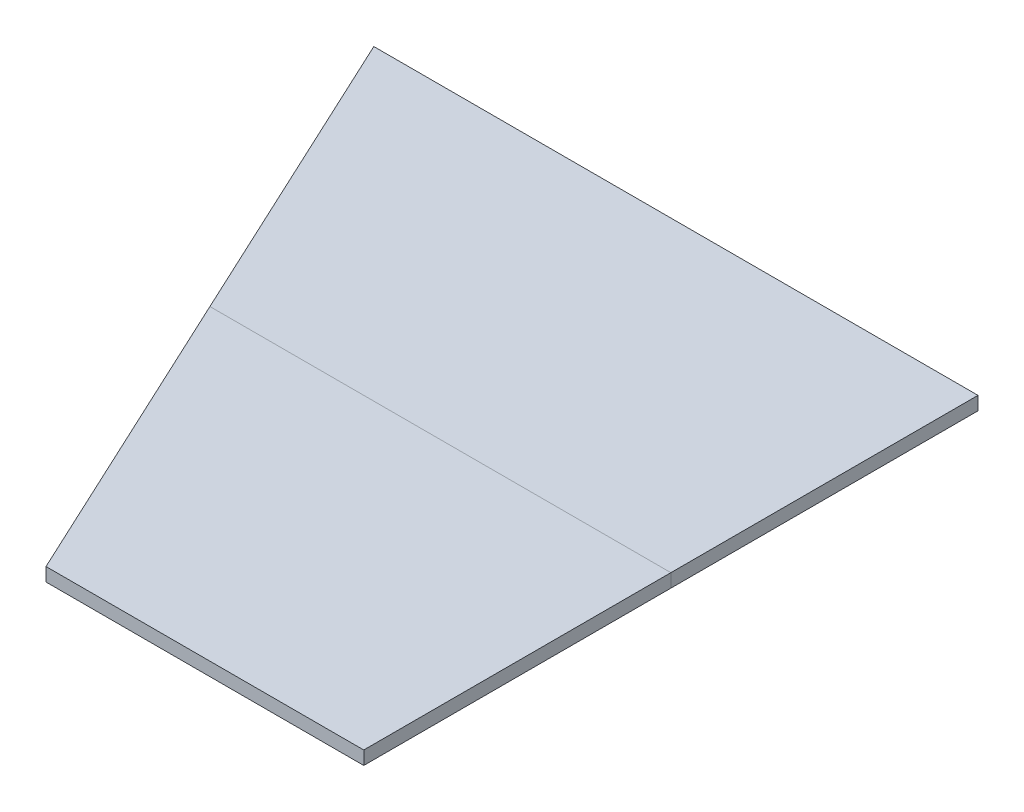
ISO-10303-21;
HEADER;
FILE_DESCRIPTION(('STEP AP214'),'2;1');
FILE_NAME('part.step','',(''),(''),'','','');
FILE_SCHEMA(('AUTOMOTIVE_DESIGN { 1 0 10303 214 1 1 1 1 }'));
ENDSEC;
DATA;
#1=APPLICATION_CONTEXT('core data for automotive mechanical design processes');
#2=APPLICATION_PROTOCOL_DEFINITION('international standard','automotive_design',2000,#1);
#3=PRODUCT_CONTEXT('',#1,'mechanical');
#4=PRODUCT('Part','Part','',(#3));
#5=PRODUCT_RELATED_PRODUCT_CATEGORY('part','',(#4));
#6=PRODUCT_DEFINITION_FORMATION('','',#4);
#7=PRODUCT_DEFINITION_CONTEXT('part definition',#1,'design');
#8=PRODUCT_DEFINITION('design','',#6,#7);
#9=PRODUCT_DEFINITION_SHAPE('','',#8);
#10=(LENGTH_UNIT() NAMED_UNIT(*) SI_UNIT(.MILLI.,.METRE.));
#11=(NAMED_UNIT(*) PLANE_ANGLE_UNIT() SI_UNIT($,.RADIAN.));
#12=(NAMED_UNIT(*) SI_UNIT($,.STERADIAN.) SOLID_ANGLE_UNIT());
#13=UNCERTAINTY_MEASURE_WITH_UNIT(LENGTH_MEASURE(1.E-05),#10,'distance_accuracy_value','');
#14=(GEOMETRIC_REPRESENTATION_CONTEXT(3) GLOBAL_UNCERTAINTY_ASSIGNED_CONTEXT((#13)) GLOBAL_UNIT_ASSIGNED_CONTEXT((#10,
#11,#12)) REPRESENTATION_CONTEXT('',''));
#15=CARTESIAN_POINT('',(0.,0.,0.));
#16=DIRECTION('',(0.,0.,1.));
#17=DIRECTION('',(1.,0.,0.));
#18=AXIS2_PLACEMENT_3D('',#15,#16,#17);
#19=CARTESIAN_POINT('',(0.,0.,91.5));
#20=DIRECTION('',(0.,0.,-1.));
#21=DIRECTION('',(-1.,0.,0.));
#22=AXIS2_PLACEMENT_3D('',#19,#20,#21);
#23=PLANE('',#22);
#24=DIRECTION('',(-1.,0.,0.));
#25=VECTOR('',#24,1.);
#26=CARTESIAN_POINT('',(0.,4.,91.5));
#27=LINE('',#26,#25);
#28=CARTESIAN_POINT('',(90.,4.,91.5));
#29=VERTEX_POINT('',#28);
#30=CARTESIAN_POINT('',(-47.3328492788179,4.,91.5));
#31=VERTEX_POINT('',#30);
#32=EDGE_CURVE('E88',#29,#31,#27,.T.);
#33=ORIENTED_EDGE('',*,*,#32,.F.);
#34=DIRECTION('',(0.,1.,0.));
#35=VECTOR('',#34,1.);
#36=CARTESIAN_POINT('',(90.,4.,91.5));
#37=LINE('',#36,#35);
#38=CARTESIAN_POINT('',(90.,0.,91.5));
#39=VERTEX_POINT('',#38);
#40=EDGE_CURVE('E96',#39,#29,#37,.T.);
#41=ORIENTED_EDGE('',*,*,#40,.F.);
#42=DIRECTION('',(-1.,0.,0.));
#43=VECTOR('',#42,1.);
#44=CARTESIAN_POINT('',(0.,0.,91.5));
#45=LINE('',#44,#43);
#46=CARTESIAN_POINT('',(-47.3328492788179,0.,91.5));
#47=VERTEX_POINT('',#46);
#48=EDGE_CURVE('E104',#39,#47,#45,.T.);
#49=ORIENTED_EDGE('',*,*,#48,.T.);
#50=DIRECTION('',(0.,1.,0.));
#51=VECTOR('',#50,1.);
#52=CARTESIAN_POINT('',(-47.3328492788179,4.,91.5));
#53=LINE('',#52,#51);
#54=EDGE_CURVE('E105',#47,#31,#53,.T.);
#55=ORIENTED_EDGE('',*,*,#54,.T.);
#56=EDGE_LOOP('',(#33,#41,#49,#55));
#57=FACE_BOUND('',#56,.T.);
#58=ADVANCED_FACE('F52',(#57),#23,.T.);
#59=CARTESIAN_POINT('',(90.,4.,0.));
#60=DIRECTION('',(1.,0.,0.));
#61=DIRECTION('',(0.,0.,-1.));
#62=AXIS2_PLACEMENT_3D('',#59,#60,#61);
#63=PLANE('',#62);
#64=DIRECTION('',(0.,0.,1.));
#65=VECTOR('',#64,1.);
#66=CARTESIAN_POINT('',(90.,0.,0.));
#67=LINE('',#66,#65);
#68=CARTESIAN_POINT('',(90.,0.,183.));
#69=VERTEX_POINT('',#68);
#70=EDGE_CURVE('E13',#39,#69,#67,.T.);
#71=ORIENTED_EDGE('',*,*,#70,.F.);
#72=ORIENTED_EDGE('',*,*,#40,.T.);
#73=DIRECTION('',(0.,0.,1.));
#74=VECTOR('',#73,1.);
#75=CARTESIAN_POINT('',(90.,4.,0.));
#76=LINE('',#75,#74);
#77=CARTESIAN_POINT('',(90.,4.,183.));
#78=VERTEX_POINT('',#77);
#79=EDGE_CURVE('E79',#29,#78,#76,.T.);
#80=ORIENTED_EDGE('',*,*,#79,.T.);
#81=DIRECTION('',(0.,-1.,0.));
#82=VECTOR('',#81,1.);
#83=CARTESIAN_POINT('',(90.,4.,183.));
#84=LINE('',#83,#82);
#85=EDGE_CURVE('E98',#78,#69,#84,.T.);
#86=ORIENTED_EDGE('',*,*,#85,.T.);
#87=EDGE_LOOP('',(#71,#72,#80,#86));
#88=FACE_BOUND('',#87,.T.);
#89=ADVANCED_FACE('F95',(#88),#63,.T.);
#90=CARTESIAN_POINT('',(-73.9254424358944,4.,34.4719999403539));
#91=DIRECTION('',(0.906307787036651,0.,-0.422618261740697));
#92=DIRECTION('',(-0.422618261740697,0.,-0.906307787036651));
#93=AXIS2_PLACEMENT_3D('',#90,#91,#92);
#94=PLANE('',#93);
#95=ORIENTED_EDGE('',*,*,#54,.F.);
#96=DIRECTION('',(0.422618261740697,0.,0.906307787036651));
#97=VECTOR('',#96,1.);
#98=CARTESIAN_POINT('',(-73.9254424358944,0.,34.4719999403539));
#99=LINE('',#98,#97);
#100=CARTESIAN_POINT('',(-4.66569855763578,0.,183.));
#101=VERTEX_POINT('',#100);
#102=EDGE_CURVE('E61',#47,#101,#99,.T.);
#103=ORIENTED_EDGE('',*,*,#102,.T.);
#104=DIRECTION('',(0.,-1.,0.));
#105=VECTOR('',#104,1.);
#106=CARTESIAN_POINT('',(-4.66569855763578,4.,183.));
#107=LINE('',#106,#105);
#108=CARTESIAN_POINT('',(-4.66569855763578,4.,183.));
#109=VERTEX_POINT('',#108);
#110=EDGE_CURVE('E121',#109,#101,#107,.T.);
#111=ORIENTED_EDGE('',*,*,#110,.F.);
#112=DIRECTION('',(0.422618261740697,0.,0.906307787036651));
#113=VECTOR('',#112,1.);
#114=CARTESIAN_POINT('',(-73.9254424358944,4.,34.4719999403539));
#115=LINE('',#114,#113);
#116=EDGE_CURVE('E111',#31,#109,#115,.T.);
#117=ORIENTED_EDGE('',*,*,#116,.F.);
#118=EDGE_LOOP('',(#95,#103,#111,#117));
#119=FACE_BOUND('',#118,.T.);
#120=ADVANCED_FACE('F126',(#119),#94,.F.);
#121=CARTESIAN_POINT('',(0.,4.,0.));
#122=DIRECTION('',(0.,1.,0.));
#123=DIRECTION('',(0.,0.,1.));
#124=AXIS2_PLACEMENT_3D('',#121,#122,#123);
#125=PLANE('',#124);
#126=ORIENTED_EDGE('',*,*,#79,.F.);
#127=ORIENTED_EDGE('',*,*,#32,.T.);
#128=ORIENTED_EDGE('',*,*,#116,.T.);
#129=DIRECTION('',(1.,0.,0.));
#130=VECTOR('',#129,1.);
#131=CARTESIAN_POINT('',(0.,4.,183.));
#132=LINE('',#131,#130);
#133=EDGE_CURVE('E113',#109,#78,#132,.T.);
#134=ORIENTED_EDGE('',*,*,#133,.T.);
#135=EDGE_LOOP('',(#126,#127,#128,#134));
#136=FACE_BOUND('',#135,.T.);
#137=ADVANCED_FACE('F54',(#136),#125,.T.);
#138=CARTESIAN_POINT('',(0.,0.,0.));
#139=DIRECTION('',(0.,1.,0.));
#140=DIRECTION('',(0.,0.,1.));
#141=AXIS2_PLACEMENT_3D('',#138,#139,#140);
#142=PLANE('',#141);
#143=ORIENTED_EDGE('',*,*,#48,.F.);
#144=ORIENTED_EDGE('',*,*,#70,.T.);
#145=DIRECTION('',(1.,0.,0.));
#146=VECTOR('',#145,1.);
#147=CARTESIAN_POINT('',(0.,0.,183.));
#148=LINE('',#147,#146);
#149=EDGE_CURVE('E114',#101,#69,#148,.T.);
#150=ORIENTED_EDGE('',*,*,#149,.F.);
#151=ORIENTED_EDGE('',*,*,#102,.F.);
#152=EDGE_LOOP('',(#143,#144,#150,#151));
#153=FACE_BOUND('',#152,.T.);
#154=ADVANCED_FACE('F107',(#153),#142,.F.);
#155=CARTESIAN_POINT('',(0.,4.,183.));
#156=DIRECTION('',(0.,0.,-1.));
#157=DIRECTION('',(-1.,0.,0.));
#158=AXIS2_PLACEMENT_3D('',#155,#156,#157);
#159=PLANE('',#158);
#160=ORIENTED_EDGE('',*,*,#149,.T.);
#161=ORIENTED_EDGE('',*,*,#85,.F.);
#162=ORIENTED_EDGE('',*,*,#133,.F.);
#163=ORIENTED_EDGE('',*,*,#110,.T.);
#164=EDGE_LOOP('',(#160,#161,#162,#163));
#165=FACE_BOUND('',#164,.T.);
#166=ADVANCED_FACE('F124',(#165),#159,.F.);
#167=CLOSED_SHELL('',(#58,#89,#120,#137,#154,#166));
#168=MANIFOLD_SOLID_BREP('B2',#167);
#169=CARTESIAN_POINT('',(0.,0.,91.5));
#170=DIRECTION('',(0.,0.,-1.));
#171=DIRECTION('',(-1.,0.,0.));
#172=AXIS2_PLACEMENT_3D('',#169,#170,#171);
#173=PLANE('',#172);
#174=DIRECTION('',(-1.,0.,0.));
#175=VECTOR('',#174,1.);
#176=CARTESIAN_POINT('',(0.,4.,91.5));
#177=LINE('',#176,#175);
#178=CARTESIAN_POINT('',(90.,4.,91.5));
#179=VERTEX_POINT('',#178);
#180=CARTESIAN_POINT('',(-47.3328492788179,4.,91.5));
#181=VERTEX_POINT('',#180);
#182=EDGE_CURVE('E50',#179,#181,#177,.T.);
#183=ORIENTED_EDGE('',*,*,#182,.T.);
#184=DIRECTION('',(0.,1.,0.));
#185=VECTOR('',#184,1.);
#186=CARTESIAN_POINT('',(-47.3328492788179,4.,91.5));
#187=LINE('',#186,#185);
#188=CARTESIAN_POINT('',(-47.3328492788179,0.,91.5));
#189=VERTEX_POINT('',#188);
#190=EDGE_CURVE('E203',#189,#181,#187,.T.);
#191=ORIENTED_EDGE('',*,*,#190,.F.);
#192=DIRECTION('',(-1.,0.,0.));
#193=VECTOR('',#192,1.);
#194=CARTESIAN_POINT('',(0.,0.,91.5));
#195=LINE('',#194,#193);
#196=CARTESIAN_POINT('',(90.,0.,91.5));
#197=VERTEX_POINT('',#196);
#198=EDGE_CURVE('E234',#197,#189,#195,.T.);
#199=ORIENTED_EDGE('',*,*,#198,.F.);
#200=DIRECTION('',(0.,1.,0.));
#201=VECTOR('',#200,1.);
#202=CARTESIAN_POINT('',(90.,4.,91.5));
#203=LINE('',#202,#201);
#204=EDGE_CURVE('E190',#197,#179,#203,.T.);
#205=ORIENTED_EDGE('',*,*,#204,.T.);
#206=EDGE_LOOP('',(#183,#191,#199,#205));
#207=FACE_BOUND('',#206,.T.);
#208=ADVANCED_FACE('F182',(#207),#173,.F.);
#209=CARTESIAN_POINT('',(0.,4.,0.));
#210=DIRECTION('',(0.,0.,-1.));
#211=DIRECTION('',(-1.,0.,0.));
#212=AXIS2_PLACEMENT_3D('',#209,#210,#211);
#213=PLANE('',#212);
#214=DIRECTION('',(1.,0.,0.));
#215=VECTOR('',#214,1.);
#216=CARTESIAN_POINT('',(0.,0.,0.));
#217=LINE('',#216,#215);
#218=CARTESIAN_POINT('',(-90.,0.,0.));
#219=VERTEX_POINT('',#218);
#220=CARTESIAN_POINT('',(90.,0.,0.));
#221=VERTEX_POINT('',#220);
#222=EDGE_CURVE('E254',#219,#221,#217,.T.);
#223=ORIENTED_EDGE('',*,*,#222,.F.);
#224=DIRECTION('',(0.,-1.,0.));
#225=VECTOR('',#224,1.);
#226=CARTESIAN_POINT('',(-90.,4.,0.));
#227=LINE('',#226,#225);
#228=CARTESIAN_POINT('',(-90.,4.,0.));
#229=VERTEX_POINT('',#228);
#230=EDGE_CURVE('E235',#229,#219,#227,.T.);
#231=ORIENTED_EDGE('',*,*,#230,.F.);
#232=DIRECTION('',(1.,0.,0.));
#233=VECTOR('',#232,1.);
#234=CARTESIAN_POINT('',(0.,4.,0.));
#235=LINE('',#234,#233);
#236=CARTESIAN_POINT('',(90.,4.,0.));
#237=VERTEX_POINT('',#236);
#238=EDGE_CURVE('E241',#229,#237,#235,.T.);
#239=ORIENTED_EDGE('',*,*,#238,.T.);
#240=DIRECTION('',(0.,-1.,0.));
#241=VECTOR('',#240,1.);
#242=CARTESIAN_POINT('',(90.,4.,0.));
#243=LINE('',#242,#241);
#244=EDGE_CURVE('E223',#237,#221,#243,.T.);
#245=ORIENTED_EDGE('',*,*,#244,.T.);
#246=EDGE_LOOP('',(#223,#231,#239,#245));
#247=FACE_BOUND('',#246,.T.);
#248=ADVANCED_FACE('F245',(#247),#213,.T.);
#249=CARTESIAN_POINT('',(-73.9254424358944,4.,34.4719999403539));
#250=DIRECTION('',(0.906307787036651,0.,-0.422618261740697));
#251=DIRECTION('',(-0.422618261740697,0.,-0.906307787036651));
#252=AXIS2_PLACEMENT_3D('',#249,#250,#251);
#253=PLANE('',#252);
#254=DIRECTION('',(0.422618261740697,0.,0.906307787036651));
#255=VECTOR('',#254,1.);
#256=CARTESIAN_POINT('',(-73.9254424358944,0.,34.4719999403539));
#257=LINE('',#256,#255);
#258=EDGE_CURVE('E243',#219,#189,#257,.T.);
#259=ORIENTED_EDGE('',*,*,#258,.T.);
#260=ORIENTED_EDGE('',*,*,#190,.T.);
#261=DIRECTION('',(0.422618261740697,0.,0.906307787036651));
#262=VECTOR('',#261,1.);
#263=CARTESIAN_POINT('',(-73.9254424358944,4.,34.4719999403539));
#264=LINE('',#263,#262);
#265=EDGE_CURVE('E247',#229,#181,#264,.T.);
#266=ORIENTED_EDGE('',*,*,#265,.F.);
#267=ORIENTED_EDGE('',*,*,#230,.T.);
#268=EDGE_LOOP('',(#259,#260,#266,#267));
#269=FACE_BOUND('',#268,.T.);
#270=ADVANCED_FACE('F268',(#269),#253,.F.);
#271=CARTESIAN_POINT('',(90.,4.,0.));
#272=DIRECTION('',(1.,0.,0.));
#273=DIRECTION('',(0.,0.,-1.));
#274=AXIS2_PLACEMENT_3D('',#271,#272,#273);
#275=PLANE('',#274);
#276=ORIENTED_EDGE('',*,*,#204,.F.);
#277=DIRECTION('',(0.,0.,1.));
#278=VECTOR('',#277,1.);
#279=CARTESIAN_POINT('',(90.,0.,0.));
#280=LINE('',#279,#278);
#281=EDGE_CURVE('E228',#221,#197,#280,.T.);
#282=ORIENTED_EDGE('',*,*,#281,.F.);
#283=ORIENTED_EDGE('',*,*,#244,.F.);
#284=DIRECTION('',(0.,0.,1.));
#285=VECTOR('',#284,1.);
#286=CARTESIAN_POINT('',(90.,4.,0.));
#287=LINE('',#286,#285);
#288=EDGE_CURVE('E226',#237,#179,#287,.T.);
#289=ORIENTED_EDGE('',*,*,#288,.T.);
#290=EDGE_LOOP('',(#276,#282,#283,#289));
#291=FACE_BOUND('',#290,.T.);
#292=ADVANCED_FACE('F225',(#291),#275,.T.);
#293=CARTESIAN_POINT('',(0.,0.,0.));
#294=DIRECTION('',(0.,1.,0.));
#295=DIRECTION('',(0.,0.,1.));
#296=AXIS2_PLACEMENT_3D('',#293,#294,#295);
#297=PLANE('',#296);
#298=ORIENTED_EDGE('',*,*,#281,.T.);
#299=ORIENTED_EDGE('',*,*,#198,.T.);
#300=ORIENTED_EDGE('',*,*,#258,.F.);
#301=ORIENTED_EDGE('',*,*,#222,.T.);
#302=EDGE_LOOP('',(#298,#299,#300,#301));
#303=FACE_BOUND('',#302,.T.);
#304=ADVANCED_FACE('F267',(#303),#297,.F.);
#305=CARTESIAN_POINT('',(0.,4.,0.));
#306=DIRECTION('',(0.,1.,0.));
#307=DIRECTION('',(0.,0.,1.));
#308=AXIS2_PLACEMENT_3D('',#305,#306,#307);
#309=PLANE('',#308);
#310=ORIENTED_EDGE('',*,*,#182,.F.);
#311=ORIENTED_EDGE('',*,*,#288,.F.);
#312=ORIENTED_EDGE('',*,*,#238,.F.);
#313=ORIENTED_EDGE('',*,*,#265,.T.);
#314=EDGE_LOOP('',(#310,#311,#312,#313));
#315=FACE_BOUND('',#314,.T.);
#316=ADVANCED_FACE('F239',(#315),#309,.T.);
#317=CLOSED_SHELL('',(#208,#248,#270,#292,#304,#316));
#318=MANIFOLD_SOLID_BREP('B7',#317);
#319=ADVANCED_BREP_SHAPE_REPRESENTATION('',(#18,#168,#318),#14);
#320=SHAPE_DEFINITION_REPRESENTATION(#9,#319);
ENDSEC;
END-ISO-10303-21;
